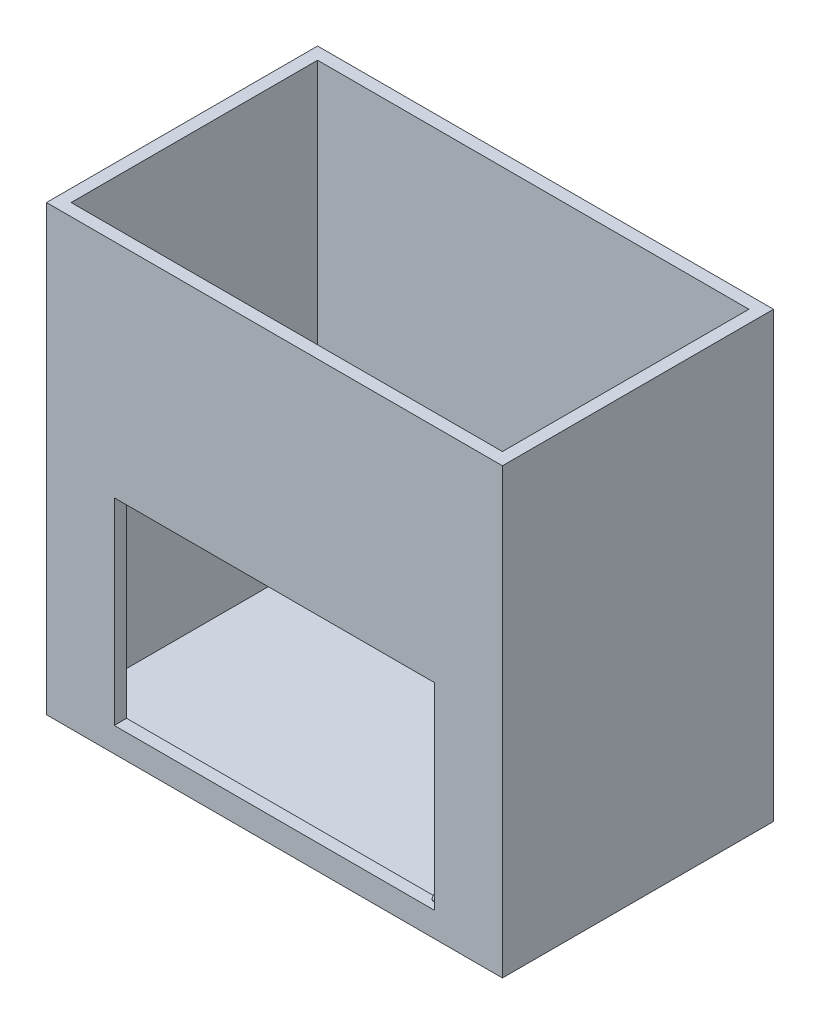
ISO-10303-21;
HEADER;
FILE_DESCRIPTION(('STEP AP214'),'2;1');
FILE_NAME('part.step','',(''),(''),'','','');
FILE_SCHEMA(('AUTOMOTIVE_DESIGN { 1 0 10303 214 1 1 1 1 }'));
ENDSEC;
DATA;
#1=APPLICATION_CONTEXT('core data for automotive mechanical design processes');
#2=APPLICATION_PROTOCOL_DEFINITION('international standard','automotive_design',2000,#1);
#3=PRODUCT_CONTEXT('',#1,'mechanical');
#4=PRODUCT('Part','Part','',(#3));
#5=PRODUCT_RELATED_PRODUCT_CATEGORY('part','',(#4));
#6=PRODUCT_DEFINITION_FORMATION('','',#4);
#7=PRODUCT_DEFINITION_CONTEXT('part definition',#1,'design');
#8=PRODUCT_DEFINITION('design','',#6,#7);
#9=PRODUCT_DEFINITION_SHAPE('','',#8);
#10=(LENGTH_UNIT() NAMED_UNIT(*) SI_UNIT(.MILLI.,.METRE.));
#11=(NAMED_UNIT(*) PLANE_ANGLE_UNIT() SI_UNIT($,.RADIAN.));
#12=(NAMED_UNIT(*) SI_UNIT($,.STERADIAN.) SOLID_ANGLE_UNIT());
#13=UNCERTAINTY_MEASURE_WITH_UNIT(LENGTH_MEASURE(1.E-05),#10,'distance_accuracy_value','');
#14=(GEOMETRIC_REPRESENTATION_CONTEXT(3) GLOBAL_UNCERTAINTY_ASSIGNED_CONTEXT((#13)) GLOBAL_UNIT_ASSIGNED_CONTEXT((#10,
#11,#12)) REPRESENTATION_CONTEXT('',''));
#15=CARTESIAN_POINT('',(0.,0.,0.));
#16=DIRECTION('',(0.,0.,1.));
#17=DIRECTION('',(1.,0.,0.));
#18=AXIS2_PLACEMENT_3D('',#15,#16,#17);
#19=CARTESIAN_POINT('',(0.,175.,0.));
#20=DIRECTION('',(0.,1.,0.));
#21=DIRECTION('',(0.,0.,1.));
#22=AXIS2_PLACEMENT_3D('',#19,#20,#21);
#23=PLANE('',#22);
#24=DIRECTION('',(0.,0.,-1.));
#25=VECTOR('',#24,1.);
#26=CARTESIAN_POINT('',(92.5,175.,-50.));
#27=LINE('',#26,#25);
#28=CARTESIAN_POINT('',(92.5,175.,55.));
#29=VERTEX_POINT('',#28);
#30=CARTESIAN_POINT('',(92.5,175.,-55.));
#31=VERTEX_POINT('',#30);
#32=EDGE_CURVE('E233',#29,#31,#27,.T.);
#33=ORIENTED_EDGE('',*,*,#32,.T.);
#34=DIRECTION('',(-1.,0.,0.));
#35=VECTOR('',#34,1.);
#36=CARTESIAN_POINT('',(-87.5,175.,-55.));
#37=LINE('',#36,#35);
#38=CARTESIAN_POINT('',(-92.5,175.,-55.));
#39=VERTEX_POINT('',#38);
#40=EDGE_CURVE('E236',#31,#39,#37,.T.);
#41=ORIENTED_EDGE('',*,*,#40,.T.);
#42=DIRECTION('',(0.,0.,1.));
#43=VECTOR('',#42,1.);
#44=CARTESIAN_POINT('',(-92.5,175.,-50.));
#45=LINE('',#44,#43);
#46=CARTESIAN_POINT('',(-92.5,175.,55.));
#47=VERTEX_POINT('',#46);
#48=EDGE_CURVE('E238',#39,#47,#45,.T.);
#49=ORIENTED_EDGE('',*,*,#48,.T.);
#50=DIRECTION('',(1.,0.,0.));
#51=VECTOR('',#50,1.);
#52=CARTESIAN_POINT('',(-87.5,175.,55.));
#53=LINE('',#52,#51);
#54=EDGE_CURVE('E240',#47,#29,#53,.T.);
#55=ORIENTED_EDGE('',*,*,#54,.T.);
#56=EDGE_LOOP('',(#33,#41,#49,#55));
#57=FACE_BOUND('',#56,.T.);
#58=DIRECTION('',(-1.,0.,0.));
#59=VECTOR('',#58,1.);
#60=CARTESIAN_POINT('',(-87.5,175.,-50.));
#61=LINE('',#60,#59);
#62=CARTESIAN_POINT('',(87.5,175.,-50.));
#63=VERTEX_POINT('',#62);
#64=CARTESIAN_POINT('',(-87.5,175.,-50.));
#65=VERTEX_POINT('',#64);
#66=EDGE_CURVE('E206',#63,#65,#61,.T.);
#67=ORIENTED_EDGE('',*,*,#66,.F.);
#68=DIRECTION('',(0.,0.,-1.));
#69=VECTOR('',#68,1.);
#70=CARTESIAN_POINT('',(87.5,175.,-50.));
#71=LINE('',#70,#69);
#72=CARTESIAN_POINT('',(87.5,175.,50.));
#73=VERTEX_POINT('',#72);
#74=EDGE_CURVE('E204',#73,#63,#71,.T.);
#75=ORIENTED_EDGE('',*,*,#74,.F.);
#76=DIRECTION('',(1.,0.,0.));
#77=VECTOR('',#76,1.);
#78=CARTESIAN_POINT('',(-87.5,175.,50.));
#79=LINE('',#78,#77);
#80=CARTESIAN_POINT('',(-87.5,175.,50.));
#81=VERTEX_POINT('',#80);
#82=EDGE_CURVE('E212',#81,#73,#79,.T.);
#83=ORIENTED_EDGE('',*,*,#82,.F.);
#84=DIRECTION('',(0.,0.,1.));
#85=VECTOR('',#84,1.);
#86=CARTESIAN_POINT('',(-87.5,175.,-50.));
#87=LINE('',#86,#85);
#88=EDGE_CURVE('E209',#65,#81,#87,.T.);
#89=ORIENTED_EDGE('',*,*,#88,.F.);
#90=EDGE_LOOP('',(#67,#75,#83,#89));
#91=FACE_BOUND('',#90,.T.);
#92=ADVANCED_FACE('F62',(#57,#91),#23,.T.);
#93=CARTESIAN_POINT('',(92.5,175.,-50.));
#94=DIRECTION('',(-1.,0.,0.));
#95=DIRECTION('',(0.,0.,1.));
#96=AXIS2_PLACEMENT_3D('',#93,#94,#95);
#97=PLANE('',#96);
#98=DIRECTION('',(0.,-1.,0.));
#99=VECTOR('',#98,1.);
#100=CARTESIAN_POINT('',(92.5,175.,55.));
#101=LINE('',#100,#99);
#102=CARTESIAN_POINT('',(92.5,-5.,55.));
#103=VERTEX_POINT('',#102);
#104=EDGE_CURVE('E242',#29,#103,#101,.T.);
#105=ORIENTED_EDGE('',*,*,#104,.T.);
#106=DIRECTION('',(0.,0.,1.));
#107=VECTOR('',#106,1.);
#108=CARTESIAN_POINT('',(92.5,-5.,55.));
#109=LINE('',#108,#107);
#110=CARTESIAN_POINT('',(92.5,-5.,-55.));
#111=VERTEX_POINT('',#110);
#112=EDGE_CURVE('E197',#111,#103,#109,.T.);
#113=ORIENTED_EDGE('',*,*,#112,.F.);
#114=DIRECTION('',(0.,-1.,0.));
#115=VECTOR('',#114,1.);
#116=CARTESIAN_POINT('',(92.5,175.,-55.));
#117=LINE('',#116,#115);
#118=EDGE_CURVE('E12',#31,#111,#117,.T.);
#119=ORIENTED_EDGE('',*,*,#118,.F.);
#120=ORIENTED_EDGE('',*,*,#32,.F.);
#121=EDGE_LOOP('',(#105,#113,#119,#120));
#122=FACE_BOUND('',#121,.T.);
#123=ADVANCED_FACE('F64',(#122),#97,.F.);
#124=CARTESIAN_POINT('',(-87.5,175.,-55.));
#125=DIRECTION('',(0.,0.,1.));
#126=DIRECTION('',(1.,0.,0.));
#127=AXIS2_PLACEMENT_3D('',#124,#125,#126);
#128=PLANE('',#127);
#129=ORIENTED_EDGE('',*,*,#118,.T.);
#130=DIRECTION('',(1.,0.,0.));
#131=VECTOR('',#130,1.);
#132=CARTESIAN_POINT('',(-92.5,-5.,-55.));
#133=LINE('',#132,#131);
#134=CARTESIAN_POINT('',(-92.5,-5.,-55.));
#135=VERTEX_POINT('',#134);
#136=EDGE_CURVE('E194',#135,#111,#133,.T.);
#137=ORIENTED_EDGE('',*,*,#136,.F.);
#138=DIRECTION('',(0.,-1.,0.));
#139=VECTOR('',#138,1.);
#140=CARTESIAN_POINT('',(-92.5,175.,-55.));
#141=LINE('',#140,#139);
#142=EDGE_CURVE('E70',#39,#135,#141,.T.);
#143=ORIENTED_EDGE('',*,*,#142,.F.);
#144=ORIENTED_EDGE('',*,*,#40,.F.);
#145=EDGE_LOOP('',(#129,#137,#143,#144));
#146=FACE_BOUND('',#145,.T.);
#147=ADVANCED_FACE('F253',(#146),#128,.F.);
#148=CARTESIAN_POINT('',(-92.5,175.,-50.));
#149=DIRECTION('',(1.,0.,0.));
#150=DIRECTION('',(0.,0.,-1.));
#151=AXIS2_PLACEMENT_3D('',#148,#149,#150);
#152=PLANE('',#151);
#153=ORIENTED_EDGE('',*,*,#142,.T.);
#154=DIRECTION('',(0.,0.,-1.));
#155=VECTOR('',#154,1.);
#156=CARTESIAN_POINT('',(-92.5,-5.,55.));
#157=LINE('',#156,#155);
#158=CARTESIAN_POINT('',(-92.5,-5.,55.));
#159=VERTEX_POINT('',#158);
#160=EDGE_CURVE('E191',#159,#135,#157,.T.);
#161=ORIENTED_EDGE('',*,*,#160,.F.);
#162=DIRECTION('',(0.,-1.,0.));
#163=VECTOR('',#162,1.);
#164=CARTESIAN_POINT('',(-92.5,175.,55.));
#165=LINE('',#164,#163);
#166=EDGE_CURVE('E244',#47,#159,#165,.T.);
#167=ORIENTED_EDGE('',*,*,#166,.F.);
#168=ORIENTED_EDGE('',*,*,#48,.F.);
#169=EDGE_LOOP('',(#153,#161,#167,#168));
#170=FACE_BOUND('',#169,.T.);
#171=ADVANCED_FACE('F250',(#170),#152,.F.);
#172=CARTESIAN_POINT('',(-87.5,175.,55.));
#173=DIRECTION('',(0.,0.,-1.));
#174=DIRECTION('',(-1.,0.,0.));
#175=AXIS2_PLACEMENT_3D('',#172,#173,#174);
#176=PLANE('',#175);
#177=DIRECTION('',(0.,-1.,0.));
#178=VECTOR('',#177,1.);
#179=CARTESIAN_POINT('',(65.,85.,55.));
#180=LINE('',#179,#178);
#181=CARTESIAN_POINT('',(65.,85.,55.));
#182=VERTEX_POINT('',#181);
#183=CARTESIAN_POINT('',(65.,5.00000000000002,55.));
#184=VERTEX_POINT('',#183);
#185=EDGE_CURVE('E165',#182,#184,#180,.T.);
#186=ORIENTED_EDGE('',*,*,#185,.T.);
#187=DIRECTION('',(1.,0.,0.));
#188=VECTOR('',#187,1.);
#189=CARTESIAN_POINT('',(-65.,5.00000000000002,55.));
#190=LINE('',#189,#188);
#191=CARTESIAN_POINT('',(-65.,5.00000000000002,55.));
#192=VERTEX_POINT('',#191);
#193=EDGE_CURVE('E182',#192,#184,#190,.T.);
#194=ORIENTED_EDGE('',*,*,#193,.F.);
#195=DIRECTION('',(0.,-1.,0.));
#196=VECTOR('',#195,1.);
#197=CARTESIAN_POINT('',(-65.,85.,55.));
#198=LINE('',#197,#196);
#199=CARTESIAN_POINT('',(-65.,85.,55.));
#200=VERTEX_POINT('',#199);
#201=EDGE_CURVE('E180',#200,#192,#198,.T.);
#202=ORIENTED_EDGE('',*,*,#201,.F.);
#203=DIRECTION('',(1.,0.,0.));
#204=VECTOR('',#203,1.);
#205=CARTESIAN_POINT('',(-65.,85.,55.));
#206=LINE('',#205,#204);
#207=EDGE_CURVE('E77',#200,#182,#206,.T.);
#208=ORIENTED_EDGE('',*,*,#207,.T.);
#209=EDGE_LOOP('',(#186,#194,#202,#208));
#210=FACE_BOUND('',#209,.T.);
#211=ORIENTED_EDGE('',*,*,#166,.T.);
#212=DIRECTION('',(-1.,0.,0.));
#213=VECTOR('',#212,1.);
#214=CARTESIAN_POINT('',(-92.5,-5.,55.));
#215=LINE('',#214,#213);
#216=EDGE_CURVE('E200',#103,#159,#215,.T.);
#217=ORIENTED_EDGE('',*,*,#216,.F.);
#218=ORIENTED_EDGE('',*,*,#104,.F.);
#219=ORIENTED_EDGE('',*,*,#54,.F.);
#220=EDGE_LOOP('',(#211,#217,#218,#219));
#221=FACE_BOUND('',#220,.T.);
#222=ADVANCED_FACE('F261',(#210,#221),#176,.F.);
#223=CARTESIAN_POINT('',(87.5,175.,-50.));
#224=DIRECTION('',(-1.,0.,0.));
#225=DIRECTION('',(0.,0.,1.));
#226=AXIS2_PLACEMENT_3D('',#223,#224,#225);
#227=PLANE('',#226);
#228=DIRECTION('',(0.,0.,-1.));
#229=VECTOR('',#228,1.);
#230=CARTESIAN_POINT('',(87.5,0.,-50.));
#231=LINE('',#230,#229);
#232=CARTESIAN_POINT('',(87.5,0.,50.));
#233=VERTEX_POINT('',#232);
#234=CARTESIAN_POINT('',(87.5,0.,-50.));
#235=VERTEX_POINT('',#234);
#236=EDGE_CURVE('E203',#233,#235,#231,.T.);
#237=ORIENTED_EDGE('',*,*,#236,.F.);
#238=DIRECTION('',(0.,-1.,0.));
#239=VECTOR('',#238,1.);
#240=CARTESIAN_POINT('',(87.5,175.,50.));
#241=LINE('',#240,#239);
#242=EDGE_CURVE('E214',#73,#233,#241,.T.);
#243=ORIENTED_EDGE('',*,*,#242,.F.);
#244=ORIENTED_EDGE('',*,*,#74,.T.);
#245=DIRECTION('',(0.,-1.,0.));
#246=VECTOR('',#245,1.);
#247=CARTESIAN_POINT('',(87.5,175.,-50.));
#248=LINE('',#247,#246);
#249=EDGE_CURVE('E230',#63,#235,#248,.T.);
#250=ORIENTED_EDGE('',*,*,#249,.T.);
#251=EDGE_LOOP('',(#237,#243,#244,#250));
#252=FACE_BOUND('',#251,.T.);
#253=ADVANCED_FACE('F277',(#252),#227,.T.);
#254=CARTESIAN_POINT('',(-87.5,175.,-50.));
#255=DIRECTION('',(0.,0.,1.));
#256=DIRECTION('',(1.,0.,0.));
#257=AXIS2_PLACEMENT_3D('',#254,#255,#256);
#258=PLANE('',#257);
#259=DIRECTION('',(-1.,0.,0.));
#260=VECTOR('',#259,1.);
#261=CARTESIAN_POINT('',(-87.5,0.,-50.));
#262=LINE('',#261,#260);
#263=CARTESIAN_POINT('',(-87.5,0.,-50.));
#264=VERTEX_POINT('',#263);
#265=EDGE_CURVE('E217',#235,#264,#262,.T.);
#266=ORIENTED_EDGE('',*,*,#265,.F.);
#267=ORIENTED_EDGE('',*,*,#249,.F.);
#268=ORIENTED_EDGE('',*,*,#66,.T.);
#269=DIRECTION('',(0.,-1.,0.));
#270=VECTOR('',#269,1.);
#271=CARTESIAN_POINT('',(-87.5,175.,-50.));
#272=LINE('',#271,#270);
#273=EDGE_CURVE('E228',#65,#264,#272,.T.);
#274=ORIENTED_EDGE('',*,*,#273,.T.);
#275=EDGE_LOOP('',(#266,#267,#268,#274));
#276=FACE_BOUND('',#275,.T.);
#277=ADVANCED_FACE('F299',(#276),#258,.T.);
#278=CARTESIAN_POINT('',(-87.5,175.,-50.));
#279=DIRECTION('',(1.,0.,0.));
#280=DIRECTION('',(0.,0.,-1.));
#281=AXIS2_PLACEMENT_3D('',#278,#279,#280);
#282=PLANE('',#281);
#283=DIRECTION('',(0.,0.,1.));
#284=VECTOR('',#283,1.);
#285=CARTESIAN_POINT('',(-87.5,0.,-50.));
#286=LINE('',#285,#284);
#287=CARTESIAN_POINT('',(-87.5,0.,50.));
#288=VERTEX_POINT('',#287);
#289=EDGE_CURVE('E220',#264,#288,#286,.T.);
#290=ORIENTED_EDGE('',*,*,#289,.F.);
#291=ORIENTED_EDGE('',*,*,#273,.F.);
#292=ORIENTED_EDGE('',*,*,#88,.T.);
#293=DIRECTION('',(0.,-1.,0.));
#294=VECTOR('',#293,1.);
#295=CARTESIAN_POINT('',(-87.5,175.,50.));
#296=LINE('',#295,#294);
#297=EDGE_CURVE('E226',#81,#288,#296,.T.);
#298=ORIENTED_EDGE('',*,*,#297,.T.);
#299=EDGE_LOOP('',(#290,#291,#292,#298));
#300=FACE_BOUND('',#299,.T.);
#301=ADVANCED_FACE('F306',(#300),#282,.T.);
#302=CARTESIAN_POINT('',(-87.5,175.,50.));
#303=DIRECTION('',(0.,0.,-1.));
#304=DIRECTION('',(-1.,0.,0.));
#305=AXIS2_PLACEMENT_3D('',#302,#303,#304);
#306=PLANE('',#305);
#307=DIRECTION('',(1.,0.,0.));
#308=VECTOR('',#307,1.);
#309=CARTESIAN_POINT('',(-65.,5.00000000000002,50.));
#310=LINE('',#309,#308);
#311=CARTESIAN_POINT('',(-65.,5.00000000000003,50.));
#312=VERTEX_POINT('',#311);
#313=CARTESIAN_POINT('',(65.,5.00000000000002,50.));
#314=VERTEX_POINT('',#313);
#315=EDGE_CURVE('E171',#312,#314,#310,.T.);
#316=ORIENTED_EDGE('',*,*,#315,.T.);
#317=DIRECTION('',(0.,-1.,0.));
#318=VECTOR('',#317,1.);
#319=CARTESIAN_POINT('',(65.,85.,50.));
#320=LINE('',#319,#318);
#321=CARTESIAN_POINT('',(65.,85.,50.));
#322=VERTEX_POINT('',#321);
#323=EDGE_CURVE('E159',#322,#314,#320,.T.);
#324=ORIENTED_EDGE('',*,*,#323,.F.);
#325=DIRECTION('',(1.,0.,0.));
#326=VECTOR('',#325,1.);
#327=CARTESIAN_POINT('',(-65.,85.,50.));
#328=LINE('',#327,#326);
#329=CARTESIAN_POINT('',(-65.,85.,50.));
#330=VERTEX_POINT('',#329);
#331=EDGE_CURVE('E149',#330,#322,#328,.T.);
#332=ORIENTED_EDGE('',*,*,#331,.F.);
#333=DIRECTION('',(0.,-1.,0.));
#334=VECTOR('',#333,1.);
#335=CARTESIAN_POINT('',(-65.,85.,50.));
#336=LINE('',#335,#334);
#337=EDGE_CURVE('E158',#330,#312,#336,.T.);
#338=ORIENTED_EDGE('',*,*,#337,.T.);
#339=EDGE_LOOP('',(#316,#324,#332,#338));
#340=FACE_BOUND('',#339,.T.);
#341=DIRECTION('',(1.,0.,0.));
#342=VECTOR('',#341,1.);
#343=CARTESIAN_POINT('',(-87.5,0.,50.));
#344=LINE('',#343,#342);
#345=EDGE_CURVE('E207',#288,#233,#344,.T.);
#346=ORIENTED_EDGE('',*,*,#345,.F.);
#347=ORIENTED_EDGE('',*,*,#297,.F.);
#348=ORIENTED_EDGE('',*,*,#82,.T.);
#349=ORIENTED_EDGE('',*,*,#242,.T.);
#350=EDGE_LOOP('',(#346,#347,#348,#349));
#351=FACE_BOUND('',#350,.T.);
#352=ADVANCED_FACE('F169',(#340,#351),#306,.T.);
#353=CARTESIAN_POINT('',(0.,0.,0.));
#354=DIRECTION('',(0.,-1.,0.));
#355=DIRECTION('',(0.,0.,-1.));
#356=AXIS2_PLACEMENT_3D('',#353,#354,#355);
#357=PLANE('',#356);
#358=ORIENTED_EDGE('',*,*,#345,.T.);
#359=ORIENTED_EDGE('',*,*,#236,.T.);
#360=ORIENTED_EDGE('',*,*,#265,.T.);
#361=ORIENTED_EDGE('',*,*,#289,.T.);
#362=EDGE_LOOP('',(#358,#359,#360,#361));
#363=FACE_BOUND('',#362,.T.);
#364=ADVANCED_FACE('F320',(#363),#357,.F.);
#365=CARTESIAN_POINT('',(0.,-5.,0.));
#366=DIRECTION('',(0.,-1.,0.));
#367=DIRECTION('',(0.,0.,-1.));
#368=AXIS2_PLACEMENT_3D('',#365,#366,#367);
#369=PLANE('',#368);
#370=ORIENTED_EDGE('',*,*,#160,.T.);
#371=ORIENTED_EDGE('',*,*,#136,.T.);
#372=ORIENTED_EDGE('',*,*,#112,.T.);
#373=ORIENTED_EDGE('',*,*,#216,.T.);
#374=EDGE_LOOP('',(#370,#371,#372,#373));
#375=FACE_BOUND('',#374,.T.);
#376=ADVANCED_FACE('F257',(#375),#369,.T.);
#377=CARTESIAN_POINT('',(-65.,5.00000000000002,-55.001));
#378=DIRECTION('',(0.,-1.,0.));
#379=DIRECTION('',(0.,0.,-1.));
#380=AXIS2_PLACEMENT_3D('',#377,#378,#379);
#381=PLANE('',#380);
#382=DIRECTION('',(0.,0.,1.));
#383=VECTOR('',#382,1.);
#384=CARTESIAN_POINT('',(-65.,5.00000000000002,-55.001));
#385=LINE('',#384,#383);
#386=EDGE_CURVE('E85',#312,#192,#385,.T.);
#387=ORIENTED_EDGE('',*,*,#386,.T.);
#388=ORIENTED_EDGE('',*,*,#193,.T.);
#389=DIRECTION('',(0.,0.,1.));
#390=VECTOR('',#389,1.);
#391=CARTESIAN_POINT('',(65.,5.00000000000002,-55.001));
#392=LINE('',#391,#390);
#393=EDGE_CURVE('E166',#314,#184,#392,.T.);
#394=ORIENTED_EDGE('',*,*,#393,.F.);
#395=ORIENTED_EDGE('',*,*,#315,.F.);
#396=EDGE_LOOP('',(#387,#388,#394,#395));
#397=FACE_BOUND('',#396,.T.);
#398=ADVANCED_FACE('F333',(#397),#381,.F.);
#399=CARTESIAN_POINT('',(65.,85.,-55.001));
#400=DIRECTION('',(-1.,0.,0.));
#401=DIRECTION('',(0.,-1.,0.));
#402=AXIS2_PLACEMENT_3D('',#399,#400,#401);
#403=PLANE('',#402);
#404=CARTESIAN_POINT('',(65.,7.50000000000002,52.5));
#405=DIRECTION('',(-1.,0.,0.));
#406=DIRECTION('',(0.,-1.,0.));
#407=AXIS2_PLACEMENT_3D('',#404,#405,#406);
#408=CIRCLE('',#407,1.5);
#409=CARTESIAN_POINT('',(65.,6.00000000000002,52.5));
#410=VERTEX_POINT('',#409);
#411=EDGE_CURVE('E175',#410,#410,#408,.T.);
#412=ORIENTED_EDGE('',*,*,#411,.F.);
#413=EDGE_LOOP('',(#412));
#414=FACE_BOUND('',#413,.T.);
#415=ORIENTED_EDGE('',*,*,#323,.T.);
#416=ORIENTED_EDGE('',*,*,#393,.T.);
#417=ORIENTED_EDGE('',*,*,#185,.F.);
#418=DIRECTION('',(0.,0.,1.));
#419=VECTOR('',#418,1.);
#420=CARTESIAN_POINT('',(65.,85.,-55.001));
#421=LINE('',#420,#419);
#422=EDGE_CURVE('E152',#322,#182,#421,.T.);
#423=ORIENTED_EDGE('',*,*,#422,.F.);
#424=EDGE_LOOP('',(#415,#416,#417,#423));
#425=FACE_BOUND('',#424,.T.);
#426=ADVANCED_FACE('F162',(#414,#425),#403,.T.);
#427=CARTESIAN_POINT('',(-65.,85.,-55.001));
#428=DIRECTION('',(0.,-1.,0.));
#429=DIRECTION('',(0.,0.,-1.));
#430=AXIS2_PLACEMENT_3D('',#427,#428,#429);
#431=PLANE('',#430);
#432=ORIENTED_EDGE('',*,*,#331,.T.);
#433=ORIENTED_EDGE('',*,*,#422,.T.);
#434=ORIENTED_EDGE('',*,*,#207,.F.);
#435=DIRECTION('',(0.,0.,1.));
#436=VECTOR('',#435,1.);
#437=CARTESIAN_POINT('',(-65.,85.,-55.001));
#438=LINE('',#437,#436);
#439=EDGE_CURVE('E154',#330,#200,#438,.T.);
#440=ORIENTED_EDGE('',*,*,#439,.F.);
#441=EDGE_LOOP('',(#432,#433,#434,#440));
#442=FACE_BOUND('',#441,.T.);
#443=ADVANCED_FACE('F151',(#442),#431,.T.);
#444=CARTESIAN_POINT('',(-65.,85.,-55.001));
#445=DIRECTION('',(-1.,0.,0.));
#446=DIRECTION('',(0.,-1.,0.));
#447=AXIS2_PLACEMENT_3D('',#444,#445,#446);
#448=PLANE('',#447);
#449=ORIENTED_EDGE('',*,*,#439,.T.);
#450=ORIENTED_EDGE('',*,*,#201,.T.);
#451=ORIENTED_EDGE('',*,*,#386,.F.);
#452=ORIENTED_EDGE('',*,*,#337,.F.);
#453=EDGE_LOOP('',(#449,#450,#451,#452));
#454=FACE_BOUND('',#453,.T.);
#455=ADVANCED_FACE('F358',(#454),#448,.F.);
#456=CARTESIAN_POINT('',(63.,7.50000000000002,52.5));
#457=DIRECTION('',(1.,0.,0.));
#458=DIRECTION('',(0.,1.,0.));
#459=AXIS2_PLACEMENT_3D('',#456,#457,#458);
#460=CYLINDRICAL_SURFACE('',#459,1.5);
#461=CARTESIAN_POINT('',(63.,7.50000000000002,52.5));
#462=DIRECTION('',(-1.,0.,0.));
#463=DIRECTION('',(0.,-1.,0.));
#464=AXIS2_PLACEMENT_3D('',#461,#462,#463);
#465=CIRCLE('',#464,1.5);
#466=CARTESIAN_POINT('',(63.,6.00000000000002,52.5));
#467=VERTEX_POINT('',#466);
#468=EDGE_CURVE('E172',#467,#467,#465,.T.);
#469=ORIENTED_EDGE('',*,*,#468,.F.);
#470=EDGE_LOOP('',(#469));
#471=FACE_BOUND('',#470,.T.);
#472=ORIENTED_EDGE('',*,*,#411,.T.);
#473=EDGE_LOOP('',(#472));
#474=FACE_BOUND('',#473,.T.);
#475=ADVANCED_FACE('F363',(#471,#474),#460,.T.);
#476=CARTESIAN_POINT('',(63.,7.50000000000002,52.5));
#477=DIRECTION('',(-1.,0.,0.));
#478=DIRECTION('',(0.,-1.,0.));
#479=AXIS2_PLACEMENT_3D('',#476,#477,#478);
#480=PLANE('',#479);
#481=ORIENTED_EDGE('',*,*,#468,.T.);
#482=EDGE_LOOP('',(#481));
#483=FACE_BOUND('',#482,.T.);
#484=ADVANCED_FACE('F369',(#483),#480,.T.);
#485=CLOSED_SHELL('',(#92,#123,#147,#171,#222,#253,#277,#301,#352,#364,#376,#398,#426,#443,#455,
#475,#484));
#486=MANIFOLD_SOLID_BREP('B2',#485);
#487=ADVANCED_BREP_SHAPE_REPRESENTATION('',(#18,#486),#14);
#488=SHAPE_DEFINITION_REPRESENTATION(#9,#487);
ENDSEC;
END-ISO-10303-21;
